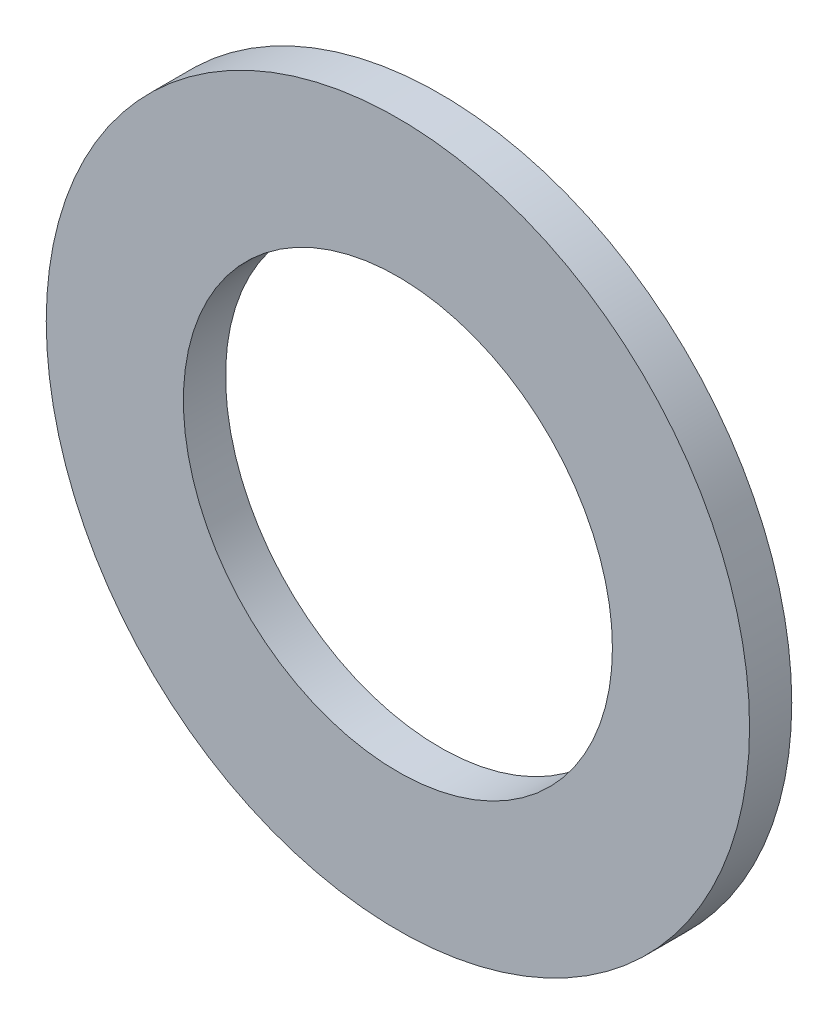
ISO-10303-21;
HEADER;
FILE_DESCRIPTION(('STEP AP214'),'2;1');
FILE_NAME('part.step','',(''),(''),'','','');
FILE_SCHEMA(('AUTOMOTIVE_DESIGN { 1 0 10303 214 1 1 1 1 }'));
ENDSEC;
DATA;
#1=APPLICATION_CONTEXT('core data for automotive mechanical design processes');
#2=APPLICATION_PROTOCOL_DEFINITION('international standard','automotive_design',2000,#1);
#3=PRODUCT_CONTEXT('',#1,'mechanical');
#4=PRODUCT('Part','Part','',(#3));
#5=PRODUCT_RELATED_PRODUCT_CATEGORY('part','',(#4));
#6=PRODUCT_DEFINITION_FORMATION('','',#4);
#7=PRODUCT_DEFINITION_CONTEXT('part definition',#1,'design');
#8=PRODUCT_DEFINITION('design','',#6,#7);
#9=PRODUCT_DEFINITION_SHAPE('','',#8);
#10=(LENGTH_UNIT() NAMED_UNIT(*) SI_UNIT(.MILLI.,.METRE.));
#11=(NAMED_UNIT(*) PLANE_ANGLE_UNIT() SI_UNIT($,.RADIAN.));
#12=(NAMED_UNIT(*) SI_UNIT($,.STERADIAN.) SOLID_ANGLE_UNIT());
#13=UNCERTAINTY_MEASURE_WITH_UNIT(LENGTH_MEASURE(1.E-05),#10,'distance_accuracy_value','');
#14=(GEOMETRIC_REPRESENTATION_CONTEXT(3) GLOBAL_UNCERTAINTY_ASSIGNED_CONTEXT((#13)) GLOBAL_UNIT_ASSIGNED_CONTEXT((#10,
#11,#12)) REPRESENTATION_CONTEXT('',''));
#15=CARTESIAN_POINT('',(0.,0.,0.));
#16=DIRECTION('',(0.,0.,1.));
#17=DIRECTION('',(1.,0.,0.));
#18=AXIS2_PLACEMENT_3D('',#15,#16,#17);
#19=CARTESIAN_POINT('',(0.,0.,0.));
#20=DIRECTION('',(0.,0.,1.));
#21=DIRECTION('',(1.,0.,0.));
#22=AXIS2_PLACEMENT_3D('',#19,#20,#21);
#23=CYLINDRICAL_SURFACE('',#22,30.5);
#24=CARTESIAN_POINT('',(0.,0.,-6.));
#25=DIRECTION('',(0.,0.,1.));
#26=DIRECTION('',(1.,0.,0.));
#27=AXIS2_PLACEMENT_3D('',#24,#25,#26);
#28=CIRCLE('',#27,30.5);
#29=CARTESIAN_POINT('',(30.5,0.,-6.));
#30=VERTEX_POINT('',#29);
#31=EDGE_CURVE('E54',#30,#30,#28,.T.);
#32=ORIENTED_EDGE('',*,*,#31,.F.);
#33=EDGE_LOOP('',(#32));
#34=FACE_BOUND('',#33,.T.);
#35=CARTESIAN_POINT('',(0.,0.,0.));
#36=DIRECTION('',(0.,0.,1.));
#37=DIRECTION('',(1.,0.,0.));
#38=AXIS2_PLACEMENT_3D('',#35,#36,#37);
#39=CIRCLE('',#38,30.5);
#40=CARTESIAN_POINT('',(30.5,0.,0.));
#41=VERTEX_POINT('',#40);
#42=EDGE_CURVE('E10',#41,#41,#39,.T.);
#43=ORIENTED_EDGE('',*,*,#42,.T.);
#44=EDGE_LOOP('',(#43));
#45=FACE_BOUND('',#44,.T.);
#46=ADVANCED_FACE('F35',(#34,#45),#23,.F.);
#47=CARTESIAN_POINT('',(0.,30.5,0.));
#48=DIRECTION('',(0.,0.,-1.));
#49=DIRECTION('',(-1.,0.,0.));
#50=AXIS2_PLACEMENT_3D('',#47,#48,#49);
#51=PLANE('',#50);
#52=ORIENTED_EDGE('',*,*,#42,.F.);
#53=EDGE_LOOP('',(#52));
#54=FACE_BOUND('',#53,.T.);
#55=CARTESIAN_POINT('',(0.,0.,0.));
#56=DIRECTION('',(0.,0.,1.));
#57=DIRECTION('',(1.,0.,0.));
#58=AXIS2_PLACEMENT_3D('',#55,#56,#57);
#59=CIRCLE('',#58,50.);
#60=CARTESIAN_POINT('',(50.,0.,0.));
#61=VERTEX_POINT('',#60);
#62=EDGE_CURVE('E42',#61,#61,#59,.T.);
#63=ORIENTED_EDGE('',*,*,#62,.T.);
#64=EDGE_LOOP('',(#63));
#65=FACE_BOUND('',#64,.T.);
#66=ADVANCED_FACE('F65',(#54,#65),#51,.F.);
#67=CARTESIAN_POINT('',(0.,0.,0.));
#68=DIRECTION('',(0.,0.,1.));
#69=DIRECTION('',(1.,0.,0.));
#70=AXIS2_PLACEMENT_3D('',#67,#68,#69);
#71=CYLINDRICAL_SURFACE('',#70,50.);
#72=ORIENTED_EDGE('',*,*,#62,.F.);
#73=EDGE_LOOP('',(#72));
#74=FACE_BOUND('',#73,.T.);
#75=CARTESIAN_POINT('',(0.,0.,-6.));
#76=DIRECTION('',(0.,0.,1.));
#77=DIRECTION('',(1.,0.,0.));
#78=AXIS2_PLACEMENT_3D('',#75,#76,#77);
#79=CIRCLE('',#78,50.);
#80=CARTESIAN_POINT('',(50.,0.,-6.));
#81=VERTEX_POINT('',#80);
#82=EDGE_CURVE('E48',#81,#81,#79,.T.);
#83=ORIENTED_EDGE('',*,*,#82,.T.);
#84=EDGE_LOOP('',(#83));
#85=FACE_BOUND('',#84,.T.);
#86=ADVANCED_FACE('F69',(#74,#85),#71,.T.);
#87=CARTESIAN_POINT('',(0.,50.,-6.));
#88=DIRECTION('',(0.,0.,1.));
#89=DIRECTION('',(1.,0.,0.));
#90=AXIS2_PLACEMENT_3D('',#87,#88,#89);
#91=PLANE('',#90);
#92=ORIENTED_EDGE('',*,*,#82,.F.);
#93=EDGE_LOOP('',(#92));
#94=FACE_BOUND('',#93,.T.);
#95=ORIENTED_EDGE('',*,*,#31,.T.);
#96=EDGE_LOOP('',(#95));
#97=FACE_BOUND('',#96,.T.);
#98=ADVANCED_FACE('F62',(#94,#97),#91,.F.);
#99=CLOSED_SHELL('',(#46,#66,#86,#98));
#100=MANIFOLD_SOLID_BREP('B2',#99);
#101=ADVANCED_BREP_SHAPE_REPRESENTATION('',(#18,#100),#14);
#102=SHAPE_DEFINITION_REPRESENTATION(#9,#101);
ENDSEC;
END-ISO-10303-21;
